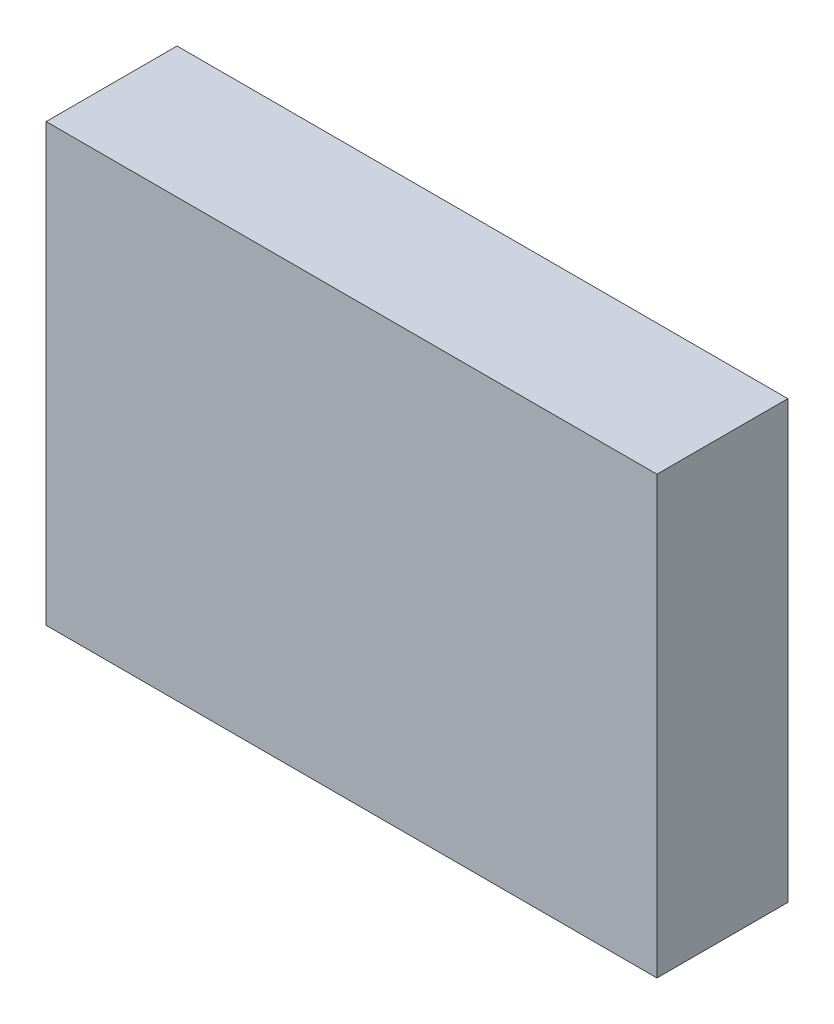
ISO-10303-21;
HEADER;
FILE_DESCRIPTION(('STEP AP214'),'2;1');
FILE_NAME('part.step','',(''),(''),'','','');
FILE_SCHEMA(('AUTOMOTIVE_DESIGN { 1 0 10303 214 1 1 1 1 }'));
ENDSEC;
DATA;
#1=APPLICATION_CONTEXT('core data for automotive mechanical design processes');
#2=APPLICATION_PROTOCOL_DEFINITION('international standard','automotive_design',2000,#1);
#3=PRODUCT_CONTEXT('',#1,'mechanical');
#4=PRODUCT('Part','Part','',(#3));
#5=PRODUCT_RELATED_PRODUCT_CATEGORY('part','',(#4));
#6=PRODUCT_DEFINITION_FORMATION('','',#4);
#7=PRODUCT_DEFINITION_CONTEXT('part definition',#1,'design');
#8=PRODUCT_DEFINITION('design','',#6,#7);
#9=PRODUCT_DEFINITION_SHAPE('','',#8);
#10=(LENGTH_UNIT() NAMED_UNIT(*) SI_UNIT(.MILLI.,.METRE.));
#11=(NAMED_UNIT(*) PLANE_ANGLE_UNIT() SI_UNIT($,.RADIAN.));
#12=(NAMED_UNIT(*) SI_UNIT($,.STERADIAN.) SOLID_ANGLE_UNIT());
#13=UNCERTAINTY_MEASURE_WITH_UNIT(LENGTH_MEASURE(1.E-05),#10,'distance_accuracy_value','');
#14=(GEOMETRIC_REPRESENTATION_CONTEXT(3) GLOBAL_UNCERTAINTY_ASSIGNED_CONTEXT((#13)) GLOBAL_UNIT_ASSIGNED_CONTEXT((#10,
#11,#12)) REPRESENTATION_CONTEXT('',''));
#15=CARTESIAN_POINT('',(0.,0.,0.));
#16=DIRECTION('',(0.,0.,1.));
#17=DIRECTION('',(1.,0.,0.));
#18=AXIS2_PLACEMENT_3D('',#15,#16,#17);
#19=CARTESIAN_POINT('',(-49.3567555844719,43.9839359296093,19.05));
#20=DIRECTION('',(1.,0.,0.));
#21=DIRECTION('',(0.,0.,-1.));
#22=AXIS2_PLACEMENT_3D('',#19,#20,#21);
#23=PLANE('',#22);
#24=DIRECTION('',(0.,-1.,0.));
#25=VECTOR('',#24,1.);
#26=CARTESIAN_POINT('',(-49.3567555844719,43.9839359296093,0.));
#27=LINE('',#26,#25);
#28=CARTESIAN_POINT('',(-49.3567555844719,43.9839359296093,0.));
#29=VERTEX_POINT('',#28);
#30=CARTESIAN_POINT('',(-49.3567555844719,-19.5160640703907,0.));
#31=VERTEX_POINT('',#30);
#32=EDGE_CURVE('E95',#29,#31,#27,.T.);
#33=ORIENTED_EDGE('',*,*,#32,.T.);
#34=DIRECTION('',(0.,0.,-1.));
#35=VECTOR('',#34,1.);
#36=CARTESIAN_POINT('',(-49.3567555844719,-19.5160640703907,19.05));
#37=LINE('',#36,#35);
#38=CARTESIAN_POINT('',(-49.3567555844719,-19.5160640703907,19.05));
#39=VERTEX_POINT('',#38);
#40=EDGE_CURVE('E11',#39,#31,#37,.T.);
#41=ORIENTED_EDGE('',*,*,#40,.F.);
#42=DIRECTION('',(0.,-1.,0.));
#43=VECTOR('',#42,1.);
#44=CARTESIAN_POINT('',(-49.3567555844719,43.9839359296093,19.05));
#45=LINE('',#44,#43);
#46=CARTESIAN_POINT('',(-49.3567555844719,43.9839359296093,19.05));
#47=VERTEX_POINT('',#46);
#48=EDGE_CURVE('E83',#47,#39,#45,.T.);
#49=ORIENTED_EDGE('',*,*,#48,.F.);
#50=DIRECTION('',(0.,0.,-1.));
#51=VECTOR('',#50,1.);
#52=CARTESIAN_POINT('',(-49.3567555844719,43.9839359296093,19.05));
#53=LINE('',#52,#51);
#54=EDGE_CURVE('E91',#47,#29,#53,.T.);
#55=ORIENTED_EDGE('',*,*,#54,.T.);
#56=EDGE_LOOP('',(#33,#41,#49,#55));
#57=FACE_BOUND('',#56,.T.);
#58=ADVANCED_FACE('F32',(#57),#23,.F.);
#59=CARTESIAN_POINT('',(-49.3567555844719,-19.5160640703907,19.05));
#60=DIRECTION('',(0.,1.,0.));
#61=DIRECTION('',(0.,0.,1.));
#62=AXIS2_PLACEMENT_3D('',#59,#60,#61);
#63=PLANE('',#62);
#64=DIRECTION('',(1.,0.,0.));
#65=VECTOR('',#64,1.);
#66=CARTESIAN_POINT('',(-49.3567555844719,-19.5160640703907,0.));
#67=LINE('',#66,#65);
#68=CARTESIAN_POINT('',(39.5432444155281,-19.5160640703907,0.));
#69=VERTEX_POINT('',#68);
#70=EDGE_CURVE('E87',#31,#69,#67,.T.);
#71=ORIENTED_EDGE('',*,*,#70,.T.);
#72=DIRECTION('',(0.,0.,-1.));
#73=VECTOR('',#72,1.);
#74=CARTESIAN_POINT('',(39.5432444155281,-19.5160640703907,19.05));
#75=LINE('',#74,#73);
#76=CARTESIAN_POINT('',(39.5432444155281,-19.5160640703907,19.05));
#77=VERTEX_POINT('',#76);
#78=EDGE_CURVE('E40',#77,#69,#75,.T.);
#79=ORIENTED_EDGE('',*,*,#78,.F.);
#80=DIRECTION('',(1.,0.,0.));
#81=VECTOR('',#80,1.);
#82=CARTESIAN_POINT('',(-49.3567555844719,-19.5160640703907,19.05));
#83=LINE('',#82,#81);
#84=EDGE_CURVE('E78',#39,#77,#83,.T.);
#85=ORIENTED_EDGE('',*,*,#84,.F.);
#86=ORIENTED_EDGE('',*,*,#40,.T.);
#87=EDGE_LOOP('',(#71,#79,#85,#86));
#88=FACE_BOUND('',#87,.T.);
#89=ADVANCED_FACE('F86',(#88),#63,.F.);
#90=CARTESIAN_POINT('',(39.5432444155281,43.9839359296093,19.05));
#91=DIRECTION('',(-1.,0.,0.));
#92=DIRECTION('',(0.,0.,1.));
#93=AXIS2_PLACEMENT_3D('',#90,#91,#92);
#94=PLANE('',#93);
#95=DIRECTION('',(0.,1.,0.));
#96=VECTOR('',#95,1.);
#97=CARTESIAN_POINT('',(39.5432444155281,43.9839359296093,0.));
#98=LINE('',#97,#96);
#99=CARTESIAN_POINT('',(39.5432444155281,43.9839359296093,0.));
#100=VERTEX_POINT('',#99);
#101=EDGE_CURVE('E65',#69,#100,#98,.T.);
#102=ORIENTED_EDGE('',*,*,#101,.T.);
#103=DIRECTION('',(0.,0.,-1.));
#104=VECTOR('',#103,1.);
#105=CARTESIAN_POINT('',(39.5432444155281,43.9839359296093,19.05));
#106=LINE('',#105,#104);
#107=CARTESIAN_POINT('',(39.5432444155281,43.9839359296093,19.05));
#108=VERTEX_POINT('',#107);
#109=EDGE_CURVE('E88',#108,#100,#106,.T.);
#110=ORIENTED_EDGE('',*,*,#109,.F.);
#111=DIRECTION('',(0.,1.,0.));
#112=VECTOR('',#111,1.);
#113=CARTESIAN_POINT('',(39.5432444155281,43.9839359296093,19.05));
#114=LINE('',#113,#112);
#115=EDGE_CURVE('E81',#77,#108,#114,.T.);
#116=ORIENTED_EDGE('',*,*,#115,.F.);
#117=ORIENTED_EDGE('',*,*,#78,.T.);
#118=EDGE_LOOP('',(#102,#110,#116,#117));
#119=FACE_BOUND('',#118,.T.);
#120=ADVANCED_FACE('F89',(#119),#94,.F.);
#121=CARTESIAN_POINT('',(-49.3567555844719,43.9839359296093,19.05));
#122=DIRECTION('',(0.,-1.,0.));
#123=DIRECTION('',(0.,0.,-1.));
#124=AXIS2_PLACEMENT_3D('',#121,#122,#123);
#125=PLANE('',#124);
#126=DIRECTION('',(-1.,0.,0.));
#127=VECTOR('',#126,1.);
#128=CARTESIAN_POINT('',(-49.3567555844719,43.9839359296093,0.));
#129=LINE('',#128,#127);
#130=EDGE_CURVE('E71',#100,#29,#129,.T.);
#131=ORIENTED_EDGE('',*,*,#130,.T.);
#132=ORIENTED_EDGE('',*,*,#54,.F.);
#133=DIRECTION('',(-1.,0.,0.));
#134=VECTOR('',#133,1.);
#135=CARTESIAN_POINT('',(-49.3567555844719,43.9839359296093,19.05));
#136=LINE('',#135,#134);
#137=EDGE_CURVE('E48',#108,#47,#136,.T.);
#138=ORIENTED_EDGE('',*,*,#137,.F.);
#139=ORIENTED_EDGE('',*,*,#109,.T.);
#140=EDGE_LOOP('',(#131,#132,#138,#139));
#141=FACE_BOUND('',#140,.T.);
#142=ADVANCED_FACE('F102',(#141),#125,.F.);
#143=CARTESIAN_POINT('',(0.,0.,19.05));
#144=DIRECTION('',(0.,0.,1.));
#145=DIRECTION('',(1.,0.,0.));
#146=AXIS2_PLACEMENT_3D('',#143,#144,#145);
#147=PLANE('',#146);
#148=ORIENTED_EDGE('',*,*,#48,.T.);
#149=ORIENTED_EDGE('',*,*,#84,.T.);
#150=ORIENTED_EDGE('',*,*,#115,.T.);
#151=ORIENTED_EDGE('',*,*,#137,.T.);
#152=EDGE_LOOP('',(#148,#149,#150,#151));
#153=FACE_BOUND('',#152,.T.);
#154=ADVANCED_FACE('F79',(#153),#147,.T.);
#155=CARTESIAN_POINT('',(0.,0.,0.));
#156=DIRECTION('',(0.,0.,1.));
#157=DIRECTION('',(1.,0.,0.));
#158=AXIS2_PLACEMENT_3D('',#155,#156,#157);
#159=PLANE('',#158);
#160=ORIENTED_EDGE('',*,*,#32,.F.);
#161=ORIENTED_EDGE('',*,*,#130,.F.);
#162=ORIENTED_EDGE('',*,*,#101,.F.);
#163=ORIENTED_EDGE('',*,*,#70,.F.);
#164=EDGE_LOOP('',(#160,#161,#162,#163));
#165=FACE_BOUND('',#164,.T.);
#166=ADVANCED_FACE('F105',(#165),#159,.F.);
#167=CLOSED_SHELL('',(#58,#89,#120,#142,#154,#166));
#168=MANIFOLD_SOLID_BREP('B2',#167);
#169=ADVANCED_BREP_SHAPE_REPRESENTATION('',(#18,#168),#14);
#170=SHAPE_DEFINITION_REPRESENTATION(#9,#169);
ENDSEC;
END-ISO-10303-21;
